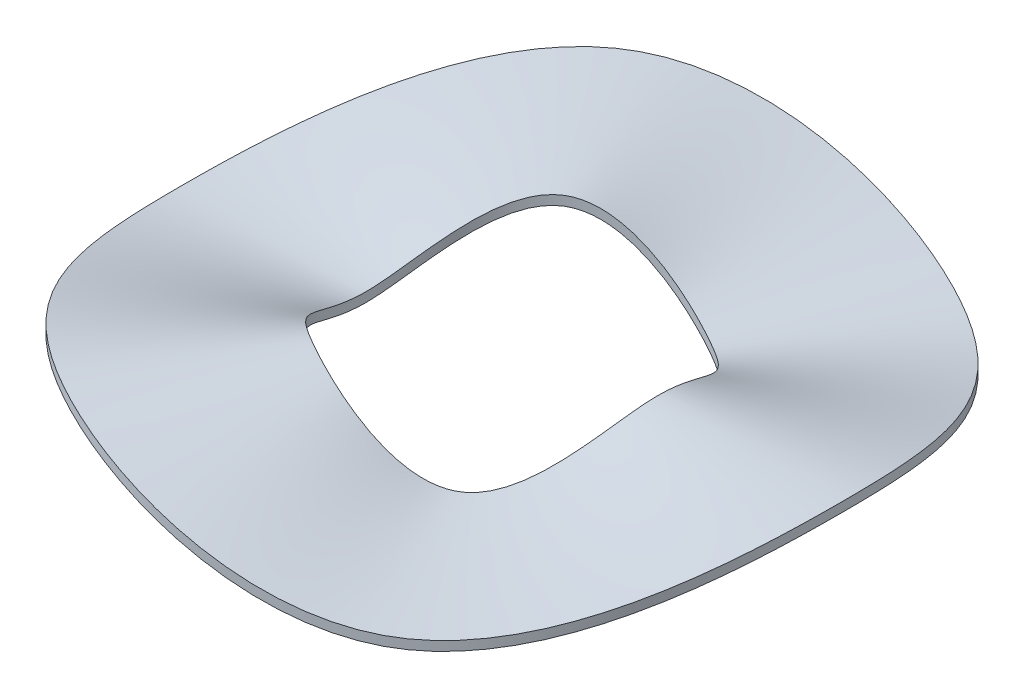
ISO-10303-21;
HEADER;
FILE_DESCRIPTION(('STEP AP214'),'2;1');
FILE_NAME('part.step','',(''),(''),'','','');
FILE_SCHEMA(('AUTOMOTIVE_DESIGN { 1 0 10303 214 1 1 1 1 }'));
ENDSEC;
DATA;
#1=APPLICATION_CONTEXT('core data for automotive mechanical design processes');
#2=APPLICATION_PROTOCOL_DEFINITION('international standard','automotive_design',2000,#1);
#3=PRODUCT_CONTEXT('',#1,'mechanical');
#4=PRODUCT('Part','Part','',(#3));
#5=PRODUCT_RELATED_PRODUCT_CATEGORY('part','',(#4));
#6=PRODUCT_DEFINITION_FORMATION('','',#4);
#7=PRODUCT_DEFINITION_CONTEXT('part definition',#1,'design');
#8=PRODUCT_DEFINITION('design','',#6,#7);
#9=PRODUCT_DEFINITION_SHAPE('','',#8);
#10=(LENGTH_UNIT() NAMED_UNIT(*) SI_UNIT(.MILLI.,.METRE.));
#11=(NAMED_UNIT(*) PLANE_ANGLE_UNIT() SI_UNIT($,.RADIAN.));
#12=(NAMED_UNIT(*) SI_UNIT($,.STERADIAN.) SOLID_ANGLE_UNIT());
#13=UNCERTAINTY_MEASURE_WITH_UNIT(LENGTH_MEASURE(1.E-05),#10,'distance_accuracy_value','');
#14=(GEOMETRIC_REPRESENTATION_CONTEXT(3) GLOBAL_UNCERTAINTY_ASSIGNED_CONTEXT((#13)) GLOBAL_UNIT_ASSIGNED_CONTEXT((#10,
#11,#12)) REPRESENTATION_CONTEXT('',''));
#15=CARTESIAN_POINT('',(0.,0.,0.));
#16=DIRECTION('',(0.,0.,1.));
#17=DIRECTION('',(1.,0.,0.));
#18=AXIS2_PLACEMENT_3D('',#15,#16,#17);
#19=CARTESIAN_POINT('',(-8.89,0.254,0.));
#20=CARTESIAN_POINT('',(-8.88999999999958,0.253999999999948,-0.153979316792654));
#21=CARTESIAN_POINT('',(-8.88110999999864,0.261619999999827,-0.461937950377856));
#22=CARTESIAN_POINT('',(-8.84177174999704,0.293623999999607,-0.922721055879463));
#23=CARTESIAN_POINT('',(-8.7770969999953,0.343915999999358,-1.38119447162898));
#24=CARTESIAN_POINT('',(-8.24102999998427,0.741679999997818,-4.11124775835868));
#25=CARTESIAN_POINT('',(-4.62279999992822,2.99720000001292,-9.23875900757852));
#26=CARTESIAN_POINT('',(5.33399999977717,-1.26999999998708,-9.23875900773956));
#27=CARTESIAN_POINT('',(10.6680000000289,3.3019999999888,2.90903355549231E-10));
#28=CARTESIAN_POINT('',(5.33400000005128,-1.27000000001608,9.23875900748445));
#29=CARTESIAN_POINT('',(-4.62279999999315,2.99719999999732,9.2387590075924));
#30=CARTESIAN_POINT('',(-8.24103000000581,0.741680000000322,4.11124775836983));
#31=CARTESIAN_POINT('',(-8.77709700000279,0.343916000000277,1.38119447163128));
#32=CARTESIAN_POINT('',(-8.8417717500021,0.293624000000228,0.922721055880499));
#33=CARTESIAN_POINT('',(-8.88111000000119,0.26162000000014,0.46193795037806));
#34=CARTESIAN_POINT('',(-8.89000000000043,0.254000000000052,0.153979316792652));
#35=CARTESIAN_POINT('',(-8.89,0.254,0.));
#36=CARTESIAN_POINT('',(-7.239,0.254,0.));
#37=CARTESIAN_POINT('',(-7.23899999999965,0.253999999999948,-0.125383157959732));
#38=CARTESIAN_POINT('',(-7.23176099999889,0.261619999999827,-0.376149473879111));
#39=CARTESIAN_POINT('',(-7.19972842499759,0.293623999999607,-0.751358574073277));
#40=CARTESIAN_POINT('',(-7.14706469999617,0.343915999999358,-1.12468692689788));
#41=CARTESIAN_POINT('',(-6.71055299998719,0.741679999997818,-3.34773031752064));
#42=CARTESIAN_POINT('',(-3.76427999994155,2.99720000001292,-7.52298947759965));
#43=CARTESIAN_POINT('',(4.34339999981855,-1.26999999998708,-7.52298947773078));
#44=CARTESIAN_POINT('',(8.68680000002353,3.3019999999888,2.36879770356205E-10));
#45=CARTESIAN_POINT('',(4.34340000004176,-1.27000000001608,7.52298947752304));
#46=CARTESIAN_POINT('',(-3.76427999999442,2.99719999999732,7.52298947761096));
#47=CARTESIAN_POINT('',(-6.71055300000473,0.741680000000322,3.34773031752972));
#48=CARTESIAN_POINT('',(-7.14706470000228,0.343916000000277,1.12468692689976));
#49=CARTESIAN_POINT('',(-7.19972842500171,0.293624000000228,0.751358574074121));
#50=CARTESIAN_POINT('',(-7.23176100000097,0.26162000000014,0.376149473879278));
#51=CARTESIAN_POINT('',(-7.23900000000035,0.254000000000052,0.125383157959731));
#52=CARTESIAN_POINT('',(-7.239,0.254,0.));
#53=CARTESIAN_POINT('',(-5.588,0.254,0.));
#54=CARTESIAN_POINT('',(-5.58799999999973,0.253999999999948,-0.0967869991268106));
#55=CARTESIAN_POINT('',(-5.58241199999914,0.261619999999827,-0.290360997380366));
#56=CARTESIAN_POINT('',(-5.55768509999814,0.293623999999607,-0.579996092267091));
#57=CARTESIAN_POINT('',(-5.51703239999704,0.343915999999358,-0.868179382166787));
#58=CARTESIAN_POINT('',(-5.18007599999011,0.741679999997818,-2.5842128766826));
#59=CARTESIAN_POINT('',(-2.90575999995488,2.99720000001292,-5.80721994762078));
#60=CARTESIAN_POINT('',(3.35279999985994,-1.26999999998708,-5.80721994772201));
#61=CARTESIAN_POINT('',(6.70560000001816,3.3019999999888,1.82854613070028E-10));
#62=CARTESIAN_POINT('',(3.35280000003223,-1.27000000001608,5.80721994756165));
#63=CARTESIAN_POINT('',(-2.9057599999957,2.99719999999732,5.80721994762951));
#64=CARTESIAN_POINT('',(-5.18007600000365,0.741680000000322,2.58421287668961));
#65=CARTESIAN_POINT('',(-5.51703240000176,0.343916000000277,0.868179382168235));
#66=CARTESIAN_POINT('',(-5.55768510000132,0.293624000000228,0.579996092267743));
#67=CARTESIAN_POINT('',(-5.58241200000075,0.26162000000014,0.290360997380495));
#68=CARTESIAN_POINT('',(-5.58800000000027,0.254000000000052,0.0967869991268099));
#69=CARTESIAN_POINT('',(-5.588,0.254,0.));
#70=CARTESIAN_POINT('',(-3.937,0.254,0.));
#71=CARTESIAN_POINT('',(-3.93699999999981,0.253999999999948,-0.0681908402938892));
#72=CARTESIAN_POINT('',(-3.9330629999994,0.261619999999827,-0.204572520881622));
#73=CARTESIAN_POINT('',(-3.91564177499869,0.293623999999607,-0.408633610460905));
#74=CARTESIAN_POINT('',(-3.88700009999792,0.343915999999358,-0.611671837435691));
#75=CARTESIAN_POINT('',(-3.64959899999303,0.741679999997818,-1.82069543584456));
#76=CARTESIAN_POINT('',(-2.04723999996821,2.99720000001292,-4.09145041764191));
#77=CARTESIAN_POINT('',(2.36219999990132,-1.26999999998708,-4.09145041771323));
#78=CARTESIAN_POINT('',(4.7244000000128,3.3019999999888,1.28829442231325E-10));
#79=CARTESIAN_POINT('',(2.36220000002271,-1.27000000001608,4.09145041760025));
#80=CARTESIAN_POINT('',(-2.04723999999697,2.99719999999732,4.09145041764806));
#81=CARTESIAN_POINT('',(-3.64959900000257,0.741680000000322,1.8206954358495));
#82=CARTESIAN_POINT('',(-3.88700010000124,0.343916000000277,0.611671837436711));
#83=CARTESIAN_POINT('',(-3.91564177500093,0.293624000000228,0.408633610461364));
#84=CARTESIAN_POINT('',(-3.93306300000053,0.26162000000014,0.204572520881712));
#85=CARTESIAN_POINT('',(-3.93700000000019,0.254000000000052,0.0681908402938888));
#86=CARTESIAN_POINT('',(-3.937,0.254,0.));
#87=B_SPLINE_SURFACE_WITH_KNOTS('',3,3,((#19,#20,#21,#22,#23,#24,#25,#26,#27,#28,#29,#30,#31,
#32,#33,#34,#35),(#36,#37,#38,#39,#40,#41,#42,#43,#44,#45,#46,#47,#48,#49,#50,#51,#52),(#53,#54,
#55,#56,#57,#58,#59,#60,#61,#62,#63,#64,#65,#66,#67,#68,#69),(#70,#71,#72,#73,#74,#75,#76,#77,
#78,#79,#80,#81,#82,#83,#84,#85,#86)),.UNSPECIFIED.,.F.,.T.,.F.,(4,4),(4,1,1,1,1,1,1,1,1,1,1,1,
1,1,4),(0.,1.),(0.,0.0083333333333333,0.0166666666666666,0.0250000000000001,0.0333333333333334,
0.166666666666694,0.333333333335959,0.499999999997,0.666666666666664,0.833333333333351,
0.966666666666667,0.975,0.983333333333333,0.991666666666667,1.),.UNSPECIFIED.);
#88=CARTESIAN_POINT('',(-8.89,0.254,0.));
#89=CARTESIAN_POINT('',(-8.88999999999958,0.253999999999948,-0.153979316792654));
#90=CARTESIAN_POINT('',(-8.88110999999864,0.261619999999827,-0.461937950377856));
#91=CARTESIAN_POINT('',(-8.84177174999704,0.293623999999607,-0.922721055879463));
#92=CARTESIAN_POINT('',(-8.7770969999953,0.343915999999358,-1.38119447162898));
#93=CARTESIAN_POINT('',(-8.24102999998427,0.741679999997818,-4.11124775835868));
#94=CARTESIAN_POINT('',(-4.62279999992822,2.99720000001292,-9.23875900757852));
#95=CARTESIAN_POINT('',(5.33399999977717,-1.26999999998708,-9.23875900773956));
#96=CARTESIAN_POINT('',(10.6680000000289,3.3019999999888,2.90903355549231E-10));
#97=CARTESIAN_POINT('',(5.33400000005128,-1.27000000001608,9.23875900748445));
#98=CARTESIAN_POINT('',(-4.62279999999315,2.99719999999732,9.2387590075924));
#99=CARTESIAN_POINT('',(-8.24103000000581,0.741680000000322,4.11124775836983));
#100=CARTESIAN_POINT('',(-8.77709700000279,0.343916000000277,1.38119447163128));
#101=CARTESIAN_POINT('',(-8.8417717500021,0.293624000000228,0.922721055880499));
#102=CARTESIAN_POINT('',(-8.88111000000119,0.26162000000014,0.46193795037806));
#103=CARTESIAN_POINT('',(-8.89000000000043,0.254000000000052,0.153979316792652));
#104=CARTESIAN_POINT('',(-8.89,0.254,0.));
#105=B_SPLINE_CURVE_WITH_KNOTS('',3,(#88,#89,#90,#91,#92,#93,#94,#95,#96,#97,#98,#99,#100,#101,
#102,#103,#104),.UNSPECIFIED.,.T.,.F.,(4,1,1,1,1,1,1,1,1,1,1,1,1,1,4),(0.,0.0083333333333333,
0.0166666666666666,0.0250000000000001,0.0333333333333334,0.166666666666694,0.333333333335959,
0.499999999997,0.666666666666664,0.833333333333351,0.966666666666667,0.975,0.983333333333333,
0.991666666666667,1.),.UNSPECIFIED.);
#106=CARTESIAN_POINT('',(-8.89,0.254,0.));
#107=VERTEX_POINT('',#106);
#108=EDGE_CURVE('E11',#107,#107,#105,.F.);
#109=CARTESIAN_POINT('',(-3.937,0.254,0.));
#110=CARTESIAN_POINT('',(-3.93699999999981,0.253999999999948,-0.0681908402938892));
#111=CARTESIAN_POINT('',(-3.9330629999994,0.261619999999827,-0.204572520881622));
#112=CARTESIAN_POINT('',(-3.91564177499869,0.293623999999607,-0.408633610460905));
#113=CARTESIAN_POINT('',(-3.88700009999792,0.343915999999358,-0.611671837435691));
#114=CARTESIAN_POINT('',(-3.64959899999303,0.741679999997818,-1.82069543584456));
#115=CARTESIAN_POINT('',(-2.04723999996821,2.99720000001292,-4.09145041764191));
#116=CARTESIAN_POINT('',(2.36219999990132,-1.26999999998708,-4.09145041771323));
#117=CARTESIAN_POINT('',(4.7244000000128,3.3019999999888,1.28829442231325E-10));
#118=CARTESIAN_POINT('',(2.36220000002271,-1.27000000001608,4.09145041760025));
#119=CARTESIAN_POINT('',(-2.04723999999697,2.99719999999732,4.09145041764806));
#120=CARTESIAN_POINT('',(-3.64959900000257,0.741680000000322,1.8206954358495));
#121=CARTESIAN_POINT('',(-3.88700010000124,0.343916000000277,0.611671837436711));
#122=CARTESIAN_POINT('',(-3.91564177500093,0.293624000000228,0.408633610461364));
#123=CARTESIAN_POINT('',(-3.93306300000053,0.26162000000014,0.204572520881712));
#124=CARTESIAN_POINT('',(-3.93700000000019,0.254000000000052,0.0681908402938888));
#125=CARTESIAN_POINT('',(-3.937,0.254,0.));
#126=B_SPLINE_CURVE_WITH_KNOTS('',3,(#109,#110,#111,#112,#113,#114,#115,#116,#117,#118,#119,
#120,#121,#122,#123,#124,#125),.UNSPECIFIED.,.T.,.F.,(4,1,1,1,1,1,1,1,1,1,1,1,1,1,4),(0.,
0.0083333333333333,0.0166666666666666,0.0250000000000001,0.0333333333333334,0.166666666666694,
0.333333333335959,0.499999999997,0.666666666666664,0.833333333333351,0.966666666666667,0.975,
0.983333333333333,0.991666666666667,1.),.UNSPECIFIED.);
#127=CARTESIAN_POINT('',(-3.937,0.254,0.));
#128=VERTEX_POINT('',#127);
#129=EDGE_CURVE('E57',#128,#128,#126,.T.);
#130=ORIENTED_EDGE('',*,*,#108,.T.);
#131=EDGE_LOOP('',(#130));
#132=FACE_BOUND('',#131,.T.);
#133=ORIENTED_EDGE('',*,*,#129,.T.);
#134=EDGE_LOOP('',(#133));
#135=FACE_BOUND('',#134,.T.);
#136=ADVANCED_FACE('F45',(#132,#135),#87,.T.);
#137=CARTESIAN_POINT('',(-8.89,0.,0.));
#138=CARTESIAN_POINT('',(-8.88999999999958,0.,-0.153979316792654));
#139=CARTESIAN_POINT('',(-8.88110999999864,0.00761999999982689,-0.461937950377856));
#140=CARTESIAN_POINT('',(-8.84177174999704,0.0396239999996069,-0.922721055879463));
#141=CARTESIAN_POINT('',(-8.7770969999953,0.0899159999993579,-1.38119447162898));
#142=CARTESIAN_POINT('',(-8.24102999998427,0.487679999997818,-4.11124775835868));
#143=CARTESIAN_POINT('',(-4.62279999992822,2.74320000001292,-9.23875900757852));
#144=CARTESIAN_POINT('',(5.33399999977717,-1.52399999998708,-9.23875900773956));
#145=CARTESIAN_POINT('',(10.6680000000289,3.0479999999888,2.90904060280643E-10));
#146=CARTESIAN_POINT('',(5.33400000005128,-1.52400000001608,9.23875900748444));
#147=CARTESIAN_POINT('',(-4.62279999999315,2.74319999999732,9.2387590075924));
#148=CARTESIAN_POINT('',(-8.24103000000581,0.487680000000322,4.11124775836983));
#149=CARTESIAN_POINT('',(-8.77709700000279,0.0899160000002771,1.38119447163128));
#150=CARTESIAN_POINT('',(-8.8417717500021,0.039624000000228,0.922721055880499));
#151=CARTESIAN_POINT('',(-8.88111000000119,0.00762000000013989,0.46193795037806));
#152=CARTESIAN_POINT('',(-8.89000000000043,0.,0.153979316792652));
#153=CARTESIAN_POINT('',(-8.89,0.,0.));
#154=CARTESIAN_POINT('',(-8.89,0.0211666666666664,0.));
#155=CARTESIAN_POINT('',(-8.88999999999958,0.0211666666666142,-0.153979316792654));
#156=CARTESIAN_POINT('',(-8.88110999999864,0.0287866666664936,-0.461937950377856));
#157=CARTESIAN_POINT('',(-8.84177174999704,0.0607906666662737,-0.922721055879463));
#158=CARTESIAN_POINT('',(-8.7770969999953,0.111082666666025,-1.38119447162898));
#159=CARTESIAN_POINT('',(-8.24102999998427,0.508846666664485,-4.11124775835868));
#160=CARTESIAN_POINT('',(-4.62279999992822,2.76436666667959,-9.23875900757852));
#161=CARTESIAN_POINT('',(5.33399999977717,-1.50283333332041,-9.23875900773956));
#162=CARTESIAN_POINT('',(10.6680000000289,3.06916666665547,2.90904060280643E-10));
#163=CARTESIAN_POINT('',(5.33400000005128,-1.50283333334941,9.23875900748444));
#164=CARTESIAN_POINT('',(-4.62279999999315,2.76436666666399,9.2387590075924));
#165=CARTESIAN_POINT('',(-8.24103000000581,0.508846666666988,4.11124775836983));
#166=CARTESIAN_POINT('',(-8.77709700000279,0.111082666666944,1.38119447163128));
#167=CARTESIAN_POINT('',(-8.8417717500021,0.0607906666668946,0.922721055880499));
#168=CARTESIAN_POINT('',(-8.88111000000119,0.0287866666668065,0.46193795037806));
#169=CARTESIAN_POINT('',(-8.89000000000043,0.0211666666667185,0.153979316792652));
#170=CARTESIAN_POINT('',(-8.89,0.0211666666666664,0.));
#171=CARTESIAN_POINT('',(-8.89000000000001,0.0635000000000001,0.));
#172=CARTESIAN_POINT('',(-8.88999999999958,0.063499999999948,-0.153979316792654));
#173=CARTESIAN_POINT('',(-8.88110999999864,0.0711199999998273,-0.461937950377856));
#174=CARTESIAN_POINT('',(-8.84177174999704,0.103123999999607,-0.922721055879464));
#175=CARTESIAN_POINT('',(-8.7770969999953,0.153415999999358,-1.38119447162898));
#176=CARTESIAN_POINT('',(-8.24102999998428,0.551179999997818,-4.11124775835869));
#177=CARTESIAN_POINT('',(-4.62279999992823,2.80670000001293,-9.23875900757853));
#178=CARTESIAN_POINT('',(5.33399999977719,-1.46049999998708,-9.23875900773956));
#179=CARTESIAN_POINT('',(10.6680000000289,3.1114999999888,2.90902962525943E-10));
#180=CARTESIAN_POINT('',(5.3340000000513,-1.46050000001608,9.23875900748445));
#181=CARTESIAN_POINT('',(-4.62279999999317,2.80669999999732,9.2387590075924));
#182=CARTESIAN_POINT('',(-8.24103000000582,0.551180000000323,4.11124775836983));
#183=CARTESIAN_POINT('',(-8.7770970000028,0.153416000000277,1.38119447163128));
#184=CARTESIAN_POINT('',(-8.84177175000211,0.103124000000228,0.9227210558805));
#185=CARTESIAN_POINT('',(-8.8811100000012,0.0711200000001403,0.46193795037806));
#186=CARTESIAN_POINT('',(-8.89000000000043,0.0635000000000523,0.153979316792652));
#187=CARTESIAN_POINT('',(-8.89000000000001,0.0635000000000001,0.));
#188=CARTESIAN_POINT('',(-8.89,0.126999999999999,0.));
#189=CARTESIAN_POINT('',(-8.88999999999957,0.126999999999947,-0.153979316792653));
#190=CARTESIAN_POINT('',(-8.88110999999863,0.134619999999827,-0.461937950377855));
#191=CARTESIAN_POINT('',(-8.84177174999703,0.166623999999607,-0.922721055879463));
#192=CARTESIAN_POINT('',(-8.77709699999529,0.216915999999358,-1.38119447162898));
#193=CARTESIAN_POINT('',(-8.24102999998426,0.614679999997817,-4.11124775835868));
#194=CARTESIAN_POINT('',(-4.6227999999282,2.87020000001292,-9.23875900757851));
#195=CARTESIAN_POINT('',(5.33399999977716,-1.39699999998708,-9.23875900773956));
#196=CARTESIAN_POINT('',(10.6680000000289,3.1749999999888,2.90906892758819E-10));
#197=CARTESIAN_POINT('',(5.33400000005126,-1.39700000001608,9.23875900748443));
#198=CARTESIAN_POINT('',(-4.62279999999314,2.87019999999732,9.2387590075924));
#199=CARTESIAN_POINT('',(-8.24103000000581,0.614680000000321,4.11124775836983));
#200=CARTESIAN_POINT('',(-8.77709700000279,0.216916000000277,1.38119447163128));
#201=CARTESIAN_POINT('',(-8.8417717500021,0.166624000000228,0.922721055880499));
#202=CARTESIAN_POINT('',(-8.88111000000119,0.13462000000014,0.46193795037806));
#203=CARTESIAN_POINT('',(-8.89000000000042,0.127000000000052,0.153979316792652));
#204=CARTESIAN_POINT('',(-8.89,0.126999999999999,0.));
#205=CARTESIAN_POINT('',(-8.89000000000001,0.1905,0.));
#206=CARTESIAN_POINT('',(-8.88999999999958,0.190499999999948,-0.153979316792654));
#207=CARTESIAN_POINT('',(-8.88110999999864,0.198119999999827,-0.461937950377856));
#208=CARTESIAN_POINT('',(-8.84177174999704,0.230123999999607,-0.922721055879464));
#209=CARTESIAN_POINT('',(-8.7770969999953,0.280415999999358,-1.38119447162898));
#210=CARTESIAN_POINT('',(-8.24102999998428,0.678179999997818,-4.11124775835869));
#211=CARTESIAN_POINT('',(-4.62279999992823,2.93370000001293,-9.23875900757853));
#212=CARTESIAN_POINT('',(5.33399999977718,-1.33349999998708,-9.23875900773956));
#213=CARTESIAN_POINT('',(10.6680000000289,3.2384999999888,2.90901918981352E-10));
#214=CARTESIAN_POINT('',(5.3340000000513,-1.33350000001608,9.23875900748445));
#215=CARTESIAN_POINT('',(-4.62279999999316,2.93369999999732,9.2387590075924));
#216=CARTESIAN_POINT('',(-8.24103000000582,0.678180000000323,4.11124775836983));
#217=CARTESIAN_POINT('',(-8.7770970000028,0.280416000000278,1.38119447163128));
#218=CARTESIAN_POINT('',(-8.84177175000211,0.230124000000228,0.922721055880499));
#219=CARTESIAN_POINT('',(-8.8811100000012,0.19812000000014,0.46193795037806));
#220=CARTESIAN_POINT('',(-8.89000000000043,0.190500000000052,0.153979316792652));
#221=CARTESIAN_POINT('',(-8.89000000000001,0.1905,0.));
#222=CARTESIAN_POINT('',(-8.89,0.232833333333333,0.));
#223=CARTESIAN_POINT('',(-8.88999999999958,0.232833333333281,-0.153979316792654));
#224=CARTESIAN_POINT('',(-8.88110999999864,0.24045333333316,-0.461937950377856));
#225=CARTESIAN_POINT('',(-8.84177174999704,0.27245733333294,-0.922721055879463));
#226=CARTESIAN_POINT('',(-8.7770969999953,0.322749333332691,-1.38119447162898));
#227=CARTESIAN_POINT('',(-8.24102999998427,0.720513333331151,-4.11124775835868));
#228=CARTESIAN_POINT('',(-4.62279999992822,2.97603333334626,-9.23875900757852));
#229=CARTESIAN_POINT('',(5.33399999977717,-1.29116666665375,-9.23875900773956));
#230=CARTESIAN_POINT('',(10.6680000000289,3.28083333332213,2.90904060280643E-10));
#231=CARTESIAN_POINT('',(5.33400000005128,-1.29116666668275,9.23875900748444));
#232=CARTESIAN_POINT('',(-4.62279999999315,2.97603333333066,9.2387590075924));
#233=CARTESIAN_POINT('',(-8.24103000000581,0.720513333333655,4.11124775836983));
#234=CARTESIAN_POINT('',(-8.77709700000279,0.32274933333361,1.38119447163128));
#235=CARTESIAN_POINT('',(-8.8417717500021,0.272457333333561,0.922721055880499));
#236=CARTESIAN_POINT('',(-8.88111000000119,0.240453333333473,0.46193795037806));
#237=CARTESIAN_POINT('',(-8.89000000000043,0.232833333333385,0.153979316792652));
#238=CARTESIAN_POINT('',(-8.89,0.232833333333333,0.));
#239=CARTESIAN_POINT('',(-8.89,0.254,0.));
#240=CARTESIAN_POINT('',(-8.88999999999958,0.253999999999948,-0.153979316792654));
#241=CARTESIAN_POINT('',(-8.88110999999864,0.261619999999827,-0.461937950377856));
#242=CARTESIAN_POINT('',(-8.84177174999704,0.293623999999607,-0.922721055879463));
#243=CARTESIAN_POINT('',(-8.7770969999953,0.343915999999358,-1.38119447162898));
#244=CARTESIAN_POINT('',(-8.24102999998427,0.741679999997818,-4.11124775835868));
#245=CARTESIAN_POINT('',(-4.62279999992822,2.99720000001292,-9.23875900757852));
#246=CARTESIAN_POINT('',(5.33399999977717,-1.26999999998708,-9.23875900773956));
#247=CARTESIAN_POINT('',(10.6680000000289,3.3019999999888,2.90904060280643E-10));
#248=CARTESIAN_POINT('',(5.33400000005128,-1.27000000001608,9.23875900748444));
#249=CARTESIAN_POINT('',(-4.62279999999315,2.99719999999732,9.2387590075924));
#250=CARTESIAN_POINT('',(-8.24103000000581,0.741680000000322,4.11124775836983));
#251=CARTESIAN_POINT('',(-8.77709700000279,0.343916000000277,1.38119447163128));
#252=CARTESIAN_POINT('',(-8.8417717500021,0.293624000000228,0.922721055880499));
#253=CARTESIAN_POINT('',(-8.88111000000119,0.26162000000014,0.46193795037806));
#254=CARTESIAN_POINT('',(-8.89000000000043,0.254000000000052,0.153979316792652));
#255=CARTESIAN_POINT('',(-8.89,0.254,0.));
#256=B_SPLINE_SURFACE_WITH_KNOTS('',3,3,((#137,#138,#139,#140,#141,#142,#143,#144,#145,#146,
#147,#148,#149,#150,#151,#152,#153),(#154,#155,#156,#157,#158,#159,#160,#161,#162,#163,#164,
#165,#166,#167,#168,#169,#170),(#171,#172,#173,#174,#175,#176,#177,#178,#179,#180,#181,#182,
#183,#184,#185,#186,#187),(#188,#189,#190,#191,#192,#193,#194,#195,#196,#197,#198,#199,#200,
#201,#202,#203,#204),(#205,#206,#207,#208,#209,#210,#211,#212,#213,#214,#215,#216,#217,#218,
#219,#220,#221),(#222,#223,#224,#225,#226,#227,#228,#229,#230,#231,#232,#233,#234,#235,#236,
#237,#238),(#239,#240,#241,#242,#243,#244,#245,#246,#247,#248,#249,#250,#251,#252,#253,#254,
#255)),.UNSPECIFIED.,.F.,.T.,.F.,(4,1,1,1,4),(4,1,1,1,1,1,1,1,1,1,1,1,1,1,4),(0.953488372093023,
0.965116279069767,0.976744186046512,0.988372093023256,1.),(0.,0.0083333333333333,
0.0166666666666666,0.0250000000000001,0.0333333333333334,0.166666666666694,0.333333333335959,
0.499999999997,0.666666666666664,0.833333333333351,0.966666666666667,0.975,0.983333333333333,
0.991666666666667,1.),.UNSPECIFIED.);
#257=CARTESIAN_POINT('',(-8.89,0.,0.));
#258=CARTESIAN_POINT('',(-8.88999999999958,0.,-0.153979316792654));
#259=CARTESIAN_POINT('',(-8.88110999999864,0.00761999999982689,-0.461937950377856));
#260=CARTESIAN_POINT('',(-8.84177174999704,0.0396239999996069,-0.922721055879463));
#261=CARTESIAN_POINT('',(-8.7770969999953,0.0899159999993579,-1.38119447162898));
#262=CARTESIAN_POINT('',(-8.24102999998427,0.487679999997818,-4.11124775835868));
#263=CARTESIAN_POINT('',(-4.62279999992822,2.74320000001292,-9.23875900757852));
#264=CARTESIAN_POINT('',(5.33399999977717,-1.52399999998708,-9.23875900773956));
#265=CARTESIAN_POINT('',(10.6680000000289,3.0479999999888,2.90904060280643E-10));
#266=CARTESIAN_POINT('',(5.33400000005128,-1.52400000001608,9.23875900748444));
#267=CARTESIAN_POINT('',(-4.62279999999315,2.74319999999732,9.2387590075924));
#268=CARTESIAN_POINT('',(-8.24103000000581,0.487680000000322,4.11124775836983));
#269=CARTESIAN_POINT('',(-8.77709700000279,0.0899160000002771,1.38119447163128));
#270=CARTESIAN_POINT('',(-8.8417717500021,0.039624000000228,0.922721055880499));
#271=CARTESIAN_POINT('',(-8.88111000000119,0.00762000000013989,0.46193795037806));
#272=CARTESIAN_POINT('',(-8.89000000000043,0.,0.153979316792652));
#273=CARTESIAN_POINT('',(-8.89,0.,0.));
#274=B_SPLINE_CURVE_WITH_KNOTS('',3,(#257,#258,#259,#260,#261,#262,#263,#264,#265,#266,#267,
#268,#269,#270,#271,#272,#273),.UNSPECIFIED.,.T.,.F.,(4,1,1,1,1,1,1,1,1,1,1,1,1,1,4),(0.,
0.0083333333333333,0.0166666666666666,0.0250000000000001,0.0333333333333334,0.166666666666694,
0.333333333335959,0.499999999997,0.666666666666664,0.833333333333351,0.966666666666667,0.975,
0.983333333333333,0.991666666666667,1.),.UNSPECIFIED.);
#275=CARTESIAN_POINT('',(-8.89,0.,0.));
#276=VERTEX_POINT('',#275);
#277=EDGE_CURVE('E51',#276,#276,#274,.T.);
#278=ORIENTED_EDGE('',*,*,#108,.F.);
#279=EDGE_LOOP('',(#278));
#280=FACE_BOUND('',#279,.T.);
#281=ORIENTED_EDGE('',*,*,#277,.F.);
#282=EDGE_LOOP('',(#281));
#283=FACE_BOUND('',#282,.T.);
#284=ADVANCED_FACE('F47',(#280,#283),#256,.T.);
#285=CARTESIAN_POINT('',(-3.937,0.,0.));
#286=CARTESIAN_POINT('',(-3.93699999999981,0.,-0.0681908402938893));
#287=CARTESIAN_POINT('',(-3.9330629999994,0.00761999999982689,-0.204572520881622));
#288=CARTESIAN_POINT('',(-3.91564177499869,0.0396239999996069,-0.408633610460905));
#289=CARTESIAN_POINT('',(-3.88700009999792,0.0899159999993579,-0.611671837435691));
#290=CARTESIAN_POINT('',(-3.64959899999304,0.487679999997818,-1.82069543584456));
#291=CARTESIAN_POINT('',(-2.04723999996821,2.74320000001292,-4.09145041764191));
#292=CARTESIAN_POINT('',(2.36219999990132,-1.52399999998708,-4.09145041771323));
#293=CARTESIAN_POINT('',(4.7244000000128,3.0479999999888,1.28829425290666E-10));
#294=CARTESIAN_POINT('',(2.36220000002271,-1.52400000001608,4.09145041760025));
#295=CARTESIAN_POINT('',(-2.04723999999697,2.74319999999732,4.09145041764806));
#296=CARTESIAN_POINT('',(-3.64959900000257,0.487680000000322,1.8206954358495));
#297=CARTESIAN_POINT('',(-3.88700010000124,0.0899160000002771,0.611671837436711));
#298=CARTESIAN_POINT('',(-3.91564177500093,0.039624000000228,0.408633610461364));
#299=CARTESIAN_POINT('',(-3.93306300000053,0.00762000000013989,0.204572520881712));
#300=CARTESIAN_POINT('',(-3.93700000000019,0.,0.0681908402938888));
#301=CARTESIAN_POINT('',(-3.937,0.,0.));
#302=CARTESIAN_POINT('',(-4.34975,0.,0.));
#303=CARTESIAN_POINT('',(-4.34974999999979,0.,-0.0753398800021198));
#304=CARTESIAN_POINT('',(-4.34540024999933,0.0076199999998269,-0.226019640006308));
#305=CARTESIAN_POINT('',(-4.32615260624855,0.039623999999607,-0.451474230912452));
#306=CARTESIAN_POINT('',(-4.2945081749977,0.0899159999993579,-0.675798723618465));
#307=CARTESIAN_POINT('',(-4.0322182499923,0.487679999997818,-2.01157479605407));
#308=CARTESIAN_POINT('',(-2.26186999996488,2.74320000001292,-4.52039280013663));
#309=CARTESIAN_POINT('',(2.60984999989097,-1.52399999998708,-4.52039280021543));
#310=CARTESIAN_POINT('',(5.21970000001414,3.0479999999888,1.42335775598582E-10));
#311=CARTESIAN_POINT('',(2.60985000002509,-1.52400000001608,4.5203928000906));
#312=CARTESIAN_POINT('',(-2.26186999999665,2.74319999999732,4.52039280014343));
#313=CARTESIAN_POINT('',(-4.03221825000284,0.487680000000322,2.01157479605952));
#314=CARTESIAN_POINT('',(-4.29450817500137,0.089916000000277,0.675798723619592));
#315=CARTESIAN_POINT('',(-4.32615260625103,0.0396240000002279,0.451474230912959));
#316=CARTESIAN_POINT('',(-4.34540025000058,0.00762000000013984,0.226019640006408));
#317=CARTESIAN_POINT('',(-4.34975000000021,0.,0.0753398800021189));
#318=CARTESIAN_POINT('',(-4.34975,0.,0.));
#319=CARTESIAN_POINT('',(-5.17525,0.,0.));
#320=CARTESIAN_POINT('',(-5.17524999999975,0.,-0.0896379594185804));
#321=CARTESIAN_POINT('',(-5.17007474999921,0.0076199999998271,-0.26891387825568));
#322=CARTESIAN_POINT('',(-5.14717426874828,0.0396239999996072,-0.537155471815545));
#323=CARTESIAN_POINT('',(-5.10952432499726,0.0899159999993583,-0.804052495984015));
#324=CARTESIAN_POINT('',(-4.79745674999084,0.487679999997819,-2.39333351647309));
#325=CARTESIAN_POINT('',(-2.69112999995821,2.74320000001293,-5.37827756512608));
#326=CARTESIAN_POINT('',(3.10514999987029,-1.52399999998708,-5.37827756521981));
#327=CARTESIAN_POINT('',(6.21030000001682,3.0479999999888,1.6934502031999E-10));
#328=CARTESIAN_POINT('',(3.10515000002985,-1.52400000001608,5.37827756507131));
#329=CARTESIAN_POINT('',(-2.69112999999602,2.74319999999732,5.37827756513415));
#330=CARTESIAN_POINT('',(-4.79745675000338,0.487680000000322,2.39333351647958));
#331=CARTESIAN_POINT('',(-5.10952432500163,0.0899160000002771,0.804052495985354));
#332=CARTESIAN_POINT('',(-5.14717426875122,0.039624000000228,0.537155471816148));
#333=CARTESIAN_POINT('',(-5.17007475000069,0.00762000000013997,0.2689138782558));
#334=CARTESIAN_POINT('',(-5.17525000000025,0.,0.0896379594185797));
#335=CARTESIAN_POINT('',(-5.17525,0.,0.));
#336=CARTESIAN_POINT('',(-6.4135,0.,0.));
#337=CARTESIAN_POINT('',(-6.41349999999969,0.,-0.111085078543271));
#338=CARTESIAN_POINT('',(-6.40708649999901,0.00761999999982703,-0.333255235629738));
#339=CARTESIAN_POINT('',(-6.37870676249786,0.039623999999607,-0.665677333170184));
#340=CARTESIAN_POINT('',(-6.3320485499966,0.0899159999993579,-0.996433154532335));
#341=CARTESIAN_POINT('',(-5.94531449998865,0.487679999997817,-2.96597159710162));
#342=CARTESIAN_POINT('',(-3.33501999994822,2.74320000001292,-6.66510471261021));
#343=CARTESIAN_POINT('',(3.84809999983925,-1.52399999998708,-6.6651047127264));
#344=CARTESIAN_POINT('',(7.69620000002084,3.0479999999888,2.09868187823863E-10));
#345=CARTESIAN_POINT('',(3.848100000037,-1.52400000001608,6.66510471254234));
#346=CARTESIAN_POINT('',(-3.33501999999506,2.74319999999732,6.66510471262023));
#347=CARTESIAN_POINT('',(-5.94531450000419,0.487680000000322,2.96597159710966));
#348=CARTESIAN_POINT('',(-6.33204855000201,0.0899160000002772,0.996433154533996));
#349=CARTESIAN_POINT('',(-6.37870676250151,0.0396240000002281,0.665677333170932));
#350=CARTESIAN_POINT('',(-6.40708650000085,0.00762000000014007,0.333255235629886));
#351=CARTESIAN_POINT('',(-6.4135000000003,0.,0.11108507854327));
#352=CARTESIAN_POINT('',(-6.4135,0.,0.));
#353=CARTESIAN_POINT('',(-7.65175000000001,0.,0.));
#354=CARTESIAN_POINT('',(-7.65174999999964,0.,-0.132532197667963));
#355=CARTESIAN_POINT('',(-7.64409824999883,0.00761999999982703,-0.397596593003798));
#356=CARTESIAN_POINT('',(-7.61023925624746,0.0396239999996071,-0.794199194524824));
#357=CARTESIAN_POINT('',(-7.55457277499596,0.0899159999993581,-1.18881381308066));
#358=CARTESIAN_POINT('',(-7.09317224998647,0.487679999997818,-3.53860967773015));
#359=CARTESIAN_POINT('',(-3.97890999993821,2.74320000001293,-7.95193186009437));
#360=CARTESIAN_POINT('',(4.59104999980821,-1.52399999998708,-7.95193186023298));
#361=CARTESIAN_POINT('',(9.18210000002488,3.0479999999888,2.50386293458842E-10));
#362=CARTESIAN_POINT('',(4.59105000004414,-1.52400000001608,7.95193186001339));
#363=CARTESIAN_POINT('',(-3.97890999999411,2.74319999999732,7.95193186010632));
#364=CARTESIAN_POINT('',(-7.09317225000501,0.487680000000322,3.53860967773975));
#365=CARTESIAN_POINT('',(-7.55457277500241,0.0899160000002771,1.18881381308264));
#366=CARTESIAN_POINT('',(-7.61023925625181,0.039624000000228,0.794199194525716));
#367=CARTESIAN_POINT('',(-7.64409825000103,0.00762000000013994,0.397596593003973));
#368=CARTESIAN_POINT('',(-7.65175000000037,0.,0.132532197667961));
#369=CARTESIAN_POINT('',(-7.65175000000001,0.,0.));
#370=CARTESIAN_POINT('',(-8.47725,0.,0.));
#371=CARTESIAN_POINT('',(-8.47724999999959,0.,-0.146830277084423));
#372=CARTESIAN_POINT('',(-8.4687727499987,0.00761999999982684,-0.440490831253169));
#373=CARTESIAN_POINT('',(-8.43126091874717,0.0396239999996069,-0.879880435427917));
#374=CARTESIAN_POINT('',(-8.36958892499552,0.0899159999993578,-1.31706758544621));
#375=CARTESIAN_POINT('',(-7.858410749985,0.487679999997818,-3.92036839814917));
#376=CARTESIAN_POINT('',(-4.40816999993155,2.74320000001292,-8.8098166250838));
#377=CARTESIAN_POINT('',(5.08634999978752,-1.52399999998708,-8.80981662523736));
#378=CARTESIAN_POINT('',(10.1727000000276,3.0479999999888,2.77397516849215E-10));
#379=CARTESIAN_POINT('',(5.0863500000489,-1.52400000001608,8.80981662499409));
#380=CARTESIAN_POINT('',(-4.40816999999347,2.74319999999732,8.80981662509704));
#381=CARTESIAN_POINT('',(-7.85841075000554,0.487680000000322,3.9203683981598));
#382=CARTESIAN_POINT('',(-8.36958892500266,0.089916000000277,1.3170675854484));
#383=CARTESIAN_POINT('',(-8.431260918752,0.0396240000002279,0.879880435428905));
#384=CARTESIAN_POINT('',(-8.46877275000113,0.00762000000013983,0.440490831253365));
#385=CARTESIAN_POINT('',(-8.4772500000004,0.,0.146830277084422));
#386=CARTESIAN_POINT('',(-8.47725,0.,0.));
#387=CARTESIAN_POINT('',(-8.89,0.,0.));
#388=CARTESIAN_POINT('',(-8.88999999999958,0.,-0.153979316792654));
#389=CARTESIAN_POINT('',(-8.88110999999864,0.00761999999982689,-0.461937950377856));
#390=CARTESIAN_POINT('',(-8.84177174999704,0.0396239999996069,-0.922721055879463));
#391=CARTESIAN_POINT('',(-8.7770969999953,0.0899159999993579,-1.38119447162898));
#392=CARTESIAN_POINT('',(-8.24102999998427,0.487679999997818,-4.11124775835868));
#393=CARTESIAN_POINT('',(-4.62279999992822,2.74320000001292,-9.23875900757852));
#394=CARTESIAN_POINT('',(5.33399999977717,-1.52399999998708,-9.23875900773956));
#395=CARTESIAN_POINT('',(10.6680000000289,3.0479999999888,2.90904060280643E-10));
#396=CARTESIAN_POINT('',(5.33400000005128,-1.52400000001608,9.23875900748444));
#397=CARTESIAN_POINT('',(-4.62279999999315,2.74319999999732,9.2387590075924));
#398=CARTESIAN_POINT('',(-8.24103000000581,0.487680000000322,4.11124775836983));
#399=CARTESIAN_POINT('',(-8.77709700000279,0.0899160000002771,1.38119447163128));
#400=CARTESIAN_POINT('',(-8.8417717500021,0.039624000000228,0.922721055880499));
#401=CARTESIAN_POINT('',(-8.88111000000119,0.00762000000013989,0.46193795037806));
#402=CARTESIAN_POINT('',(-8.89000000000043,0.,0.153979316792652));
#403=CARTESIAN_POINT('',(-8.89,0.,0.));
#404=B_SPLINE_SURFACE_WITH_KNOTS('',3,3,((#285,#286,#287,#288,#289,#290,#291,#292,#293,#294,
#295,#296,#297,#298,#299,#300,#301),(#302,#303,#304,#305,#306,#307,#308,#309,#310,#311,#312,
#313,#314,#315,#316,#317,#318),(#319,#320,#321,#322,#323,#324,#325,#326,#327,#328,#329,#330,
#331,#332,#333,#334,#335),(#336,#337,#338,#339,#340,#341,#342,#343,#344,#345,#346,#347,#348,
#349,#350,#351,#352),(#353,#354,#355,#356,#357,#358,#359,#360,#361,#362,#363,#364,#365,#366,
#367,#368,#369),(#370,#371,#372,#373,#374,#375,#376,#377,#378,#379,#380,#381,#382,#383,#384,
#385,#386),(#387,#388,#389,#390,#391,#392,#393,#394,#395,#396,#397,#398,#399,#400,#401,#402,
#403)),.UNSPECIFIED.,.F.,.T.,.F.,(4,1,1,1,4),(4,1,1,1,1,1,1,1,1,1,1,1,1,1,4),
(0.0465116279069767,0.273255813953488,0.5,0.726744186046512,0.953488372093023),(0.,
0.0083333333333333,0.0166666666666666,0.0250000000000001,0.0333333333333334,0.166666666666694,
0.333333333335959,0.499999999997,0.666666666666664,0.833333333333351,0.966666666666667,0.975,
0.983333333333333,0.991666666666667,1.),.UNSPECIFIED.);
#405=CARTESIAN_POINT('',(-3.937,0.,0.));
#406=CARTESIAN_POINT('',(-3.93699999999981,0.,-0.0681908402938893));
#407=CARTESIAN_POINT('',(-3.9330629999994,0.00761999999982689,-0.204572520881622));
#408=CARTESIAN_POINT('',(-3.91564177499869,0.0396239999996069,-0.408633610460905));
#409=CARTESIAN_POINT('',(-3.88700009999792,0.0899159999993579,-0.611671837435691));
#410=CARTESIAN_POINT('',(-3.64959899999304,0.487679999997818,-1.82069543584456));
#411=CARTESIAN_POINT('',(-2.04723999996821,2.74320000001292,-4.09145041764191));
#412=CARTESIAN_POINT('',(2.36219999990132,-1.52399999998708,-4.09145041771323));
#413=CARTESIAN_POINT('',(4.7244000000128,3.0479999999888,1.28829425290666E-10));
#414=CARTESIAN_POINT('',(2.36220000002271,-1.52400000001608,4.09145041760025));
#415=CARTESIAN_POINT('',(-2.04723999999697,2.74319999999732,4.09145041764806));
#416=CARTESIAN_POINT('',(-3.64959900000257,0.487680000000322,1.8206954358495));
#417=CARTESIAN_POINT('',(-3.88700010000124,0.0899160000002771,0.611671837436711));
#418=CARTESIAN_POINT('',(-3.91564177500093,0.039624000000228,0.408633610461364));
#419=CARTESIAN_POINT('',(-3.93306300000053,0.00762000000013989,0.204572520881712));
#420=CARTESIAN_POINT('',(-3.93700000000019,0.,0.0681908402938888));
#421=CARTESIAN_POINT('',(-3.937,0.,0.));
#422=B_SPLINE_CURVE_WITH_KNOTS('',3,(#405,#406,#407,#408,#409,#410,#411,#412,#413,#414,#415,
#416,#417,#418,#419,#420,#421),.UNSPECIFIED.,.T.,.F.,(4,1,1,1,1,1,1,1,1,1,1,1,1,1,4),(0.,
0.0083333333333333,0.0166666666666666,0.0250000000000001,0.0333333333333334,0.166666666666694,
0.333333333335959,0.499999999997,0.666666666666664,0.833333333333351,0.966666666666667,0.975,
0.983333333333333,0.991666666666667,1.),.UNSPECIFIED.);
#423=CARTESIAN_POINT('',(-3.937,0.,0.));
#424=VERTEX_POINT('',#423);
#425=EDGE_CURVE('E70',#424,#424,#422,.T.);
#426=ORIENTED_EDGE('',*,*,#277,.T.);
#427=EDGE_LOOP('',(#426));
#428=FACE_BOUND('',#427,.T.);
#429=ORIENTED_EDGE('',*,*,#425,.F.);
#430=EDGE_LOOP('',(#429));
#431=FACE_BOUND('',#430,.T.);
#432=ADVANCED_FACE('F85',(#428,#431),#404,.T.);
#433=CARTESIAN_POINT('',(-3.937,0.254,0.));
#434=CARTESIAN_POINT('',(-3.93699999999981,0.253999999999948,-0.0681908402938893));
#435=CARTESIAN_POINT('',(-3.9330629999994,0.261619999999827,-0.204572520881622));
#436=CARTESIAN_POINT('',(-3.91564177499869,0.293623999999607,-0.408633610460905));
#437=CARTESIAN_POINT('',(-3.88700009999792,0.343915999999358,-0.611671837435691));
#438=CARTESIAN_POINT('',(-3.64959899999303,0.741679999997818,-1.82069543584456));
#439=CARTESIAN_POINT('',(-2.04723999996821,2.99720000001292,-4.09145041764191));
#440=CARTESIAN_POINT('',(2.36219999990132,-1.26999999998708,-4.09145041771323));
#441=CARTESIAN_POINT('',(4.7244000000128,3.3019999999888,1.28829625190442E-10));
#442=CARTESIAN_POINT('',(2.36220000002271,-1.27000000001608,4.09145041760025));
#443=CARTESIAN_POINT('',(-2.04723999999697,2.99719999999732,4.09145041764806));
#444=CARTESIAN_POINT('',(-3.64959900000257,0.741680000000322,1.8206954358495));
#445=CARTESIAN_POINT('',(-3.88700010000124,0.343916000000277,0.61167183743671));
#446=CARTESIAN_POINT('',(-3.91564177500093,0.293624000000228,0.408633610461364));
#447=CARTESIAN_POINT('',(-3.93306300000053,0.26162000000014,0.204572520881712));
#448=CARTESIAN_POINT('',(-3.93700000000019,0.254000000000052,0.0681908402938887));
#449=CARTESIAN_POINT('',(-3.937,0.254,0.));
#450=CARTESIAN_POINT('',(-3.937,0.232833333333333,0.));
#451=CARTESIAN_POINT('',(-3.93699999999981,0.232833333333281,-0.0681908402938892));
#452=CARTESIAN_POINT('',(-3.9330629999994,0.24045333333316,-0.204572520881622));
#453=CARTESIAN_POINT('',(-3.91564177499869,0.272457333332941,-0.408633610460905));
#454=CARTESIAN_POINT('',(-3.88700009999792,0.322749333332691,-0.611671837435691));
#455=CARTESIAN_POINT('',(-3.64959899999303,0.720513333331151,-1.82069543584456));
#456=CARTESIAN_POINT('',(-2.04723999996821,2.97603333334626,-4.09145041764191));
#457=CARTESIAN_POINT('',(2.36219999990132,-1.29116666665375,-4.09145041771323));
#458=CARTESIAN_POINT('',(4.7244000000128,3.28083333332213,1.28829997884938E-10));
#459=CARTESIAN_POINT('',(2.36220000002271,-1.29116666668275,4.09145041760025));
#460=CARTESIAN_POINT('',(-2.04723999999697,2.97603333333066,4.09145041764807));
#461=CARTESIAN_POINT('',(-3.64959900000257,0.720513333333656,1.8206954358495));
#462=CARTESIAN_POINT('',(-3.88700010000124,0.322749333333611,0.611671837436711));
#463=CARTESIAN_POINT('',(-3.91564177500093,0.272457333333561,0.408633610461364));
#464=CARTESIAN_POINT('',(-3.93306300000053,0.240453333333473,0.204572520881712));
#465=CARTESIAN_POINT('',(-3.93700000000019,0.232833333333385,0.0681908402938888));
#466=CARTESIAN_POINT('',(-3.937,0.232833333333333,0.));
#467=CARTESIAN_POINT('',(-3.937,0.1905,0.));
#468=CARTESIAN_POINT('',(-3.93699999999981,0.190499999999948,-0.0681908402938892));
#469=CARTESIAN_POINT('',(-3.9330629999994,0.198119999999827,-0.204572520881622));
#470=CARTESIAN_POINT('',(-3.91564177499869,0.230123999999607,-0.408633610460905));
#471=CARTESIAN_POINT('',(-3.88700009999792,0.280415999999358,-0.611671837435691));
#472=CARTESIAN_POINT('',(-3.64959899999303,0.678179999997818,-1.82069543584456));
#473=CARTESIAN_POINT('',(-2.04723999996821,2.93370000001293,-4.09145041764191));
#474=CARTESIAN_POINT('',(2.36219999990132,-1.33349999998708,-4.09145041771323));
#475=CARTESIAN_POINT('',(4.7244000000128,3.2384999999888,1.28830309593063E-10));
#476=CARTESIAN_POINT('',(2.36220000002271,-1.33350000001608,4.09145041760025));
#477=CARTESIAN_POINT('',(-2.04723999999697,2.93369999999732,4.09145041764806));
#478=CARTESIAN_POINT('',(-3.64959900000258,0.678180000000322,1.8206954358495));
#479=CARTESIAN_POINT('',(-3.88700010000124,0.280416000000277,0.61167183743671));
#480=CARTESIAN_POINT('',(-3.91564177500093,0.230124000000228,0.408633610461364));
#481=CARTESIAN_POINT('',(-3.93306300000053,0.19812000000014,0.204572520881712));
#482=CARTESIAN_POINT('',(-3.93700000000019,0.190500000000052,0.0681908402938887));
#483=CARTESIAN_POINT('',(-3.937,0.1905,0.));
#484=CARTESIAN_POINT('',(-3.937,0.127,0.));
#485=CARTESIAN_POINT('',(-3.93699999999981,0.126999999999948,-0.0681908402938893));
#486=CARTESIAN_POINT('',(-3.93306299999939,0.134619999999827,-0.204572520881622));
#487=CARTESIAN_POINT('',(-3.91564177499868,0.166623999999607,-0.408633610460906));
#488=CARTESIAN_POINT('',(-3.88700009999791,0.216915999999358,-0.611671837435692));
#489=CARTESIAN_POINT('',(-3.64959899999303,0.614679999997817,-1.82069543584456));
#490=CARTESIAN_POINT('',(-2.04723999996821,2.87020000001292,-4.09145041764192));
#491=CARTESIAN_POINT('',(2.36219999990131,-1.39699999998708,-4.09145041771324));
#492=CARTESIAN_POINT('',(4.72440000001279,3.1749999999888,1.2882875105244E-10));
#493=CARTESIAN_POINT('',(2.36220000002271,-1.39700000001608,4.09145041760026));
#494=CARTESIAN_POINT('',(-2.04723999999696,2.87019999999732,4.09145041764807));
#495=CARTESIAN_POINT('',(-3.64959900000257,0.614680000000322,1.8206954358495));
#496=CARTESIAN_POINT('',(-3.88700010000123,0.216916000000277,0.611671837436711));
#497=CARTESIAN_POINT('',(-3.91564177500093,0.166624000000228,0.408633610461364));
#498=CARTESIAN_POINT('',(-3.93306300000052,0.13462000000014,0.204572520881713));
#499=CARTESIAN_POINT('',(-3.93700000000018,0.127000000000052,0.0681908402938889));
#500=CARTESIAN_POINT('',(-3.937,0.127,0.));
#501=CARTESIAN_POINT('',(-3.937,0.0634999999999998,0.));
#502=CARTESIAN_POINT('',(-3.93699999999981,0.0634999999999476,-0.0681908402938892));
#503=CARTESIAN_POINT('',(-3.9330629999994,0.071119999999827,-0.204572520881622));
#504=CARTESIAN_POINT('',(-3.91564177499869,0.103123999999607,-0.408633610460905));
#505=CARTESIAN_POINT('',(-3.88700009999792,0.153415999999358,-0.611671837435691));
#506=CARTESIAN_POINT('',(-3.64959899999304,0.551179999997818,-1.82069543584456));
#507=CARTESIAN_POINT('',(-2.04723999996821,2.80670000001293,-4.09145041764191));
#508=CARTESIAN_POINT('',(2.36219999990132,-1.46049999998708,-4.09145041771323));
#509=CARTESIAN_POINT('',(4.7244000000128,3.1114999999888,1.2883102448887E-10));
#510=CARTESIAN_POINT('',(2.36220000002271,-1.46050000001608,4.09145041760024));
#511=CARTESIAN_POINT('',(-2.04723999999697,2.80669999999732,4.09145041764806));
#512=CARTESIAN_POINT('',(-3.64959900000258,0.551180000000323,1.8206954358495));
#513=CARTESIAN_POINT('',(-3.88700010000124,0.153416000000277,0.61167183743671));
#514=CARTESIAN_POINT('',(-3.91564177500093,0.103124000000228,0.408633610461364));
#515=CARTESIAN_POINT('',(-3.93306300000053,0.07112000000014,0.204572520881712));
#516=CARTESIAN_POINT('',(-3.93700000000019,0.063500000000052,0.0681908402938888));
#517=CARTESIAN_POINT('',(-3.937,0.0634999999999998,0.));
#518=CARTESIAN_POINT('',(-3.937,0.0211666666666664,0.));
#519=CARTESIAN_POINT('',(-3.93699999999981,0.0211666666666142,-0.0681908402938895));
#520=CARTESIAN_POINT('',(-3.9330629999994,0.0287866666664936,-0.204572520881622));
#521=CARTESIAN_POINT('',(-3.91564177499869,0.0607906666662737,-0.408633610460905));
#522=CARTESIAN_POINT('',(-3.88700009999792,0.111082666666025,-0.611671837435691));
#523=CARTESIAN_POINT('',(-3.64959899999304,0.508846666664485,-1.82069543584456));
#524=CARTESIAN_POINT('',(-2.04723999996821,2.76436666667959,-4.09145041764192));
#525=CARTESIAN_POINT('',(2.36219999990132,-1.50283333332041,-4.09145041771323));
#526=CARTESIAN_POINT('',(4.7244000000128,3.06916666665547,1.28829242331549E-10));
#527=CARTESIAN_POINT('',(2.36220000002271,-1.50283333334941,4.09145041760025));
#528=CARTESIAN_POINT('',(-2.04723999999697,2.76436666666399,4.09145041764806));
#529=CARTESIAN_POINT('',(-3.64959900000257,0.508846666666988,1.8206954358495));
#530=CARTESIAN_POINT('',(-3.88700010000124,0.111082666666944,0.611671837436711));
#531=CARTESIAN_POINT('',(-3.91564177500093,0.0607906666668946,0.408633610461364));
#532=CARTESIAN_POINT('',(-3.93306300000053,0.0287866666668065,0.204572520881712));
#533=CARTESIAN_POINT('',(-3.93700000000019,0.0211666666667185,0.0681908402938886));
#534=CARTESIAN_POINT('',(-3.937,0.0211666666666664,0.));
#535=CARTESIAN_POINT('',(-3.937,0.,0.));
#536=CARTESIAN_POINT('',(-3.93699999999981,0.,-0.0681908402938893));
#537=CARTESIAN_POINT('',(-3.9330629999994,0.00761999999982689,-0.204572520881622));
#538=CARTESIAN_POINT('',(-3.91564177499869,0.0396239999996069,-0.408633610460905));
#539=CARTESIAN_POINT('',(-3.88700009999792,0.0899159999993579,-0.611671837435691));
#540=CARTESIAN_POINT('',(-3.64959899999304,0.487679999997818,-1.82069543584456));
#541=CARTESIAN_POINT('',(-2.04723999996821,2.74320000001292,-4.09145041764191));
#542=CARTESIAN_POINT('',(2.36219999990132,-1.52399999998708,-4.09145041771323));
#543=CARTESIAN_POINT('',(4.7244000000128,3.0479999999888,1.28829425290666E-10));
#544=CARTESIAN_POINT('',(2.36220000002271,-1.52400000001608,4.09145041760025));
#545=CARTESIAN_POINT('',(-2.04723999999697,2.74319999999732,4.09145041764806));
#546=CARTESIAN_POINT('',(-3.64959900000257,0.487680000000322,1.8206954358495));
#547=CARTESIAN_POINT('',(-3.88700010000124,0.0899160000002771,0.611671837436711));
#548=CARTESIAN_POINT('',(-3.91564177500093,0.039624000000228,0.408633610461364));
#549=CARTESIAN_POINT('',(-3.93306300000053,0.00762000000013989,0.204572520881712));
#550=CARTESIAN_POINT('',(-3.93700000000019,0.,0.0681908402938888));
#551=CARTESIAN_POINT('',(-3.937,0.,0.));
#552=B_SPLINE_SURFACE_WITH_KNOTS('',3,3,((#433,#434,#435,#436,#437,#438,#439,#440,#441,#442,
#443,#444,#445,#446,#447,#448,#449),(#450,#451,#452,#453,#454,#455,#456,#457,#458,#459,#460,
#461,#462,#463,#464,#465,#466),(#467,#468,#469,#470,#471,#472,#473,#474,#475,#476,#477,#478,
#479,#480,#481,#482,#483),(#484,#485,#486,#487,#488,#489,#490,#491,#492,#493,#494,#495,#496,
#497,#498,#499,#500),(#501,#502,#503,#504,#505,#506,#507,#508,#509,#510,#511,#512,#513,#514,
#515,#516,#517),(#518,#519,#520,#521,#522,#523,#524,#525,#526,#527,#528,#529,#530,#531,#532,
#533,#534),(#535,#536,#537,#538,#539,#540,#541,#542,#543,#544,#545,#546,#547,#548,#549,#550,
#551)),.UNSPECIFIED.,.F.,.T.,.F.,(4,1,1,1,4),(4,1,1,1,1,1,1,1,1,1,1,1,1,1,4),(0.,
0.0116279069767442,0.0232558139534883,0.0348837209302325,0.0465116279069767),(0.,
0.0083333333333333,0.0166666666666666,0.0250000000000001,0.0333333333333334,0.166666666666694,
0.333333333335959,0.499999999997,0.666666666666664,0.833333333333351,0.966666666666667,0.975,
0.983333333333333,0.991666666666667,1.),.UNSPECIFIED.);
#553=ORIENTED_EDGE('',*,*,#425,.T.);
#554=EDGE_LOOP('',(#553));
#555=FACE_BOUND('',#554,.T.);
#556=ORIENTED_EDGE('',*,*,#129,.F.);
#557=EDGE_LOOP('',(#556));
#558=FACE_BOUND('',#557,.T.);
#559=ADVANCED_FACE('F94',(#555,#558),#552,.T.);
#560=CLOSED_SHELL('',(#136,#284,#432,#559));
#561=MANIFOLD_SOLID_BREP('B2',#560);
#562=ADVANCED_BREP_SHAPE_REPRESENTATION('',(#18,#561),#14);
#563=SHAPE_DEFINITION_REPRESENTATION(#9,#562);
ENDSEC;
END-ISO-10303-21;
